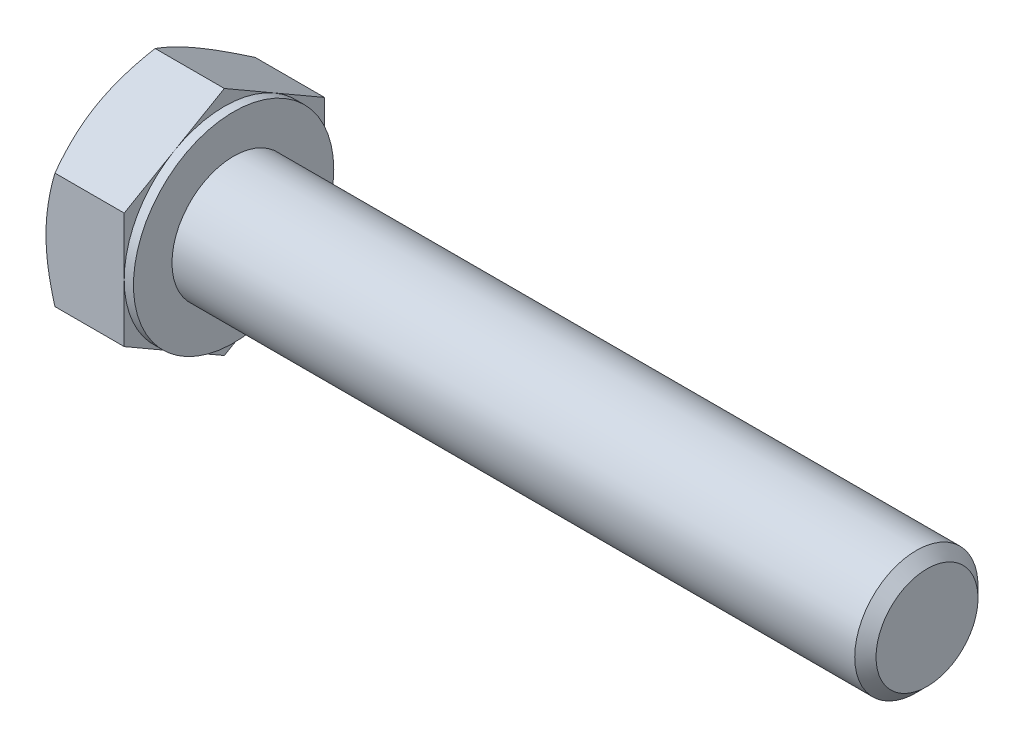
ISO-10303-21;
HEADER;
FILE_DESCRIPTION(('STEP AP214'),'2;1');
FILE_NAME('part.step','',(''),(''),'','','');
FILE_SCHEMA(('AUTOMOTIVE_DESIGN { 1 0 10303 214 1 1 1 1 }'));
ENDSEC;
DATA;
#1=APPLICATION_CONTEXT('core data for automotive mechanical design processes');
#2=APPLICATION_PROTOCOL_DEFINITION('international standard','automotive_design',2000,#1);
#3=PRODUCT_CONTEXT('',#1,'mechanical');
#4=PRODUCT('Part','Part','',(#3));
#5=PRODUCT_RELATED_PRODUCT_CATEGORY('part','',(#4));
#6=PRODUCT_DEFINITION_FORMATION('','',#4);
#7=PRODUCT_DEFINITION_CONTEXT('part definition',#1,'design');
#8=PRODUCT_DEFINITION('design','',#6,#7);
#9=PRODUCT_DEFINITION_SHAPE('','',#8);
#10=(LENGTH_UNIT() NAMED_UNIT(*) SI_UNIT(.MILLI.,.METRE.));
#11=(NAMED_UNIT(*) PLANE_ANGLE_UNIT() SI_UNIT($,.RADIAN.));
#12=(NAMED_UNIT(*) SI_UNIT($,.STERADIAN.) SOLID_ANGLE_UNIT());
#13=UNCERTAINTY_MEASURE_WITH_UNIT(LENGTH_MEASURE(1.E-05),#10,'distance_accuracy_value','');
#14=(GEOMETRIC_REPRESENTATION_CONTEXT(3) GLOBAL_UNCERTAINTY_ASSIGNED_CONTEXT((#13)) GLOBAL_UNIT_ASSIGNED_CONTEXT((#10,
#11,#12)) REPRESENTATION_CONTEXT('',''));
#15=CARTESIAN_POINT('',(0.,0.,0.));
#16=DIRECTION('',(0.,0.,1.));
#17=DIRECTION('',(1.,0.,0.));
#18=AXIS2_PLACEMENT_3D('',#15,#16,#17);
#19=CARTESIAN_POINT('',(5.675,7.50555349946514,0.));
#20=DIRECTION('',(1.,0.,0.));
#21=DIRECTION('',(0.,0.,-1.));
#22=AXIS2_PLACEMENT_3D('',#19,#20,#21);
#23=PLANE('',#22);
#24=CARTESIAN_POINT('',(5.675,0.,0.));
#25=DIRECTION('',(1.,0.,0.));
#26=DIRECTION('',(0.,0.,-1.));
#27=AXIS2_PLACEMENT_3D('',#24,#25,#26);
#28=CIRCLE('',#27,4.);
#29=CARTESIAN_POINT('',(5.675,0.,-4.));
#30=VERTEX_POINT('',#29);
#31=EDGE_CURVE('E270',#30,#30,#28,.F.);
#32=ORIENTED_EDGE('',*,*,#31,.T.);
#33=EDGE_LOOP('',(#32));
#34=FACE_BOUND('',#33,.T.);
#35=CARTESIAN_POINT('',(5.675,0.,0.));
#36=DIRECTION('',(1.,0.,0.));
#37=DIRECTION('',(0.,0.,-1.));
#38=AXIS2_PLACEMENT_3D('',#35,#36,#37);
#39=CIRCLE('',#38,6.5);
#40=CARTESIAN_POINT('',(5.675,0.,-6.5));
#41=VERTEX_POINT('',#40);
#42=EDGE_CURVE('E289',#41,#41,#39,.T.);
#43=ORIENTED_EDGE('',*,*,#42,.T.);
#44=EDGE_LOOP('',(#43));
#45=FACE_BOUND('',#44,.T.);
#46=ADVANCED_FACE('F32',(#34,#45),#23,.T.);
#47=CARTESIAN_POINT('',(0.,0.,0.));
#48=DIRECTION('',(-1.,0.,0.));
#49=DIRECTION('',(0.,0.,1.));
#50=AXIS2_PLACEMENT_3D('',#47,#48,#49);
#51=CYLINDRICAL_SURFACE('',#50,4.);
#52=ORIENTED_EDGE('',*,*,#31,.F.);
#53=EDGE_LOOP('',(#52));
#54=FACE_BOUND('',#53,.T.);
#55=CARTESIAN_POINT('',(49.9845,0.,0.));
#56=DIRECTION('',(-1.,0.,0.));
#57=DIRECTION('',(0.,0.,1.));
#58=AXIS2_PLACEMENT_3D('',#55,#56,#57);
#59=CIRCLE('',#58,4.);
#60=CARTESIAN_POINT('',(49.9845,0.,4.));
#61=VERTEX_POINT('',#60);
#62=EDGE_CURVE('E267',#61,#61,#59,.T.);
#63=ORIENTED_EDGE('',*,*,#62,.T.);
#64=EDGE_LOOP('',(#63));
#65=FACE_BOUND('',#64,.T.);
#66=ADVANCED_FACE('F241',(#54,#65),#51,.T.);
#67=CARTESIAN_POINT('',(50.675,0.,0.));
#68=DIRECTION('',(-1.,0.,0.));
#69=DIRECTION('',(0.,0.,1.));
#70=AXIS2_PLACEMENT_3D('',#67,#68,#69);
#71=CONICAL_SURFACE('',#70,3.3095,0.785398163397441);
#72=ORIENTED_EDGE('',*,*,#62,.F.);
#73=EDGE_LOOP('',(#72));
#74=FACE_BOUND('',#73,.T.);
#75=CARTESIAN_POINT('',(50.675,0.,0.));
#76=DIRECTION('',(-1.,0.,0.));
#77=DIRECTION('',(0.,0.,1.));
#78=AXIS2_PLACEMENT_3D('',#75,#76,#77);
#79=CIRCLE('',#78,3.3095);
#80=CARTESIAN_POINT('',(50.675,0.,3.3095));
#81=VERTEX_POINT('',#80);
#82=EDGE_CURVE('E265',#81,#81,#79,.T.);
#83=ORIENTED_EDGE('',*,*,#82,.T.);
#84=EDGE_LOOP('',(#83));
#85=FACE_BOUND('',#84,.T.);
#86=ADVANCED_FACE('F246',(#74,#85),#71,.T.);
#87=CARTESIAN_POINT('',(50.675,0.,0.));
#88=DIRECTION('',(-1.,0.,0.));
#89=DIRECTION('',(0.,0.,1.));
#90=AXIS2_PLACEMENT_3D('',#87,#88,#89);
#91=PLANE('',#90);
#92=ORIENTED_EDGE('',*,*,#82,.F.);
#93=EDGE_LOOP('',(#92));
#94=FACE_BOUND('',#93,.T.);
#95=ADVANCED_FACE('F253',(#94),#91,.F.);
#96=CARTESIAN_POINT('',(5.075,6.5,0.));
#97=DIRECTION('',(1.,0.,0.));
#98=DIRECTION('',(0.,0.,-1.));
#99=AXIS2_PLACEMENT_3D('',#96,#97,#98);
#100=PLANE('',#99);
#101=DIRECTION('',(0.,0.500000000000001,0.866025403784438));
#102=VECTOR('',#101,1.);
#103=CARTESIAN_POINT('',(5.075,3.75277674973256,-6.5));
#104=LINE('',#103,#102);
#105=CARTESIAN_POINT('',(5.075,3.75277674973256,-6.5));
#106=VERTEX_POINT('',#105);
#107=CARTESIAN_POINT('',(5.075,5.62916512459885,-3.25000000000001));
#108=VERTEX_POINT('',#107);
#109=EDGE_CURVE('E165',#106,#108,#104,.T.);
#110=ORIENTED_EDGE('',*,*,#109,.T.);
#111=CARTESIAN_POINT('',(5.075,0.,0.));
#112=DIRECTION('',(-1.,0.,0.));
#113=DIRECTION('',(0.,0.,1.));
#114=AXIS2_PLACEMENT_3D('',#111,#112,#113);
#115=CIRCLE('',#114,6.5);
#116=CARTESIAN_POINT('',(5.075,0.,-6.5));
#117=VERTEX_POINT('',#116);
#118=EDGE_CURVE('E48',#108,#117,#115,.T.);
#119=ORIENTED_EDGE('',*,*,#118,.T.);
#120=DIRECTION('',(0.,1.,0.));
#121=VECTOR('',#120,1.);
#122=CARTESIAN_POINT('',(5.075,3.75277674973256,-6.5));
#123=LINE('',#122,#121);
#124=EDGE_CURVE('E37',#117,#106,#123,.T.);
#125=ORIENTED_EDGE('',*,*,#124,.T.);
#126=EDGE_LOOP('',(#110,#119,#125));
#127=FACE_BOUND('',#126,.T.);
#128=ADVANCED_FACE('F256',(#127),#100,.T.);
#129=CARTESIAN_POINT('',(5.075,7.50555349946514,0.));
#130=VERTEX_POINT('',#129);
#131=EDGE_CURVE('E163',#108,#130,#104,.T.);
#132=ORIENTED_EDGE('',*,*,#131,.T.);
#133=DIRECTION('',(0.,-0.500000000000001,0.866025403784438));
#134=VECTOR('',#133,1.);
#135=CARTESIAN_POINT('',(5.075,7.50555349946514,0.));
#136=LINE('',#135,#134);
#137=CARTESIAN_POINT('',(5.075,5.62916512459885,3.25000000000001));
#138=VERTEX_POINT('',#137);
#139=EDGE_CURVE('E162',#130,#138,#136,.T.);
#140=ORIENTED_EDGE('',*,*,#139,.T.);
#141=EDGE_CURVE('E151',#138,#108,#115,.T.);
#142=ORIENTED_EDGE('',*,*,#141,.T.);
#143=EDGE_LOOP('',(#132,#140,#142));
#144=FACE_BOUND('',#143,.T.);
#145=ADVANCED_FACE('F261',(#144),#100,.T.);
#146=CARTESIAN_POINT('',(5.075,3.75277674973256,6.5));
#147=VERTEX_POINT('',#146);
#148=EDGE_CURVE('E130',#138,#147,#136,.T.);
#149=ORIENTED_EDGE('',*,*,#148,.T.);
#150=DIRECTION('',(0.,-1.,0.));
#151=VECTOR('',#150,1.);
#152=CARTESIAN_POINT('',(5.075,3.75277674973256,6.5));
#153=LINE('',#152,#151);
#154=CARTESIAN_POINT('',(5.075,0.,6.5));
#155=VERTEX_POINT('',#154);
#156=EDGE_CURVE('E124',#147,#155,#153,.T.);
#157=ORIENTED_EDGE('',*,*,#156,.T.);
#158=EDGE_CURVE('E128',#155,#138,#115,.T.);
#159=ORIENTED_EDGE('',*,*,#158,.T.);
#160=EDGE_LOOP('',(#149,#157,#159));
#161=FACE_BOUND('',#160,.T.);
#162=ADVANCED_FACE('F126',(#161),#100,.T.);
#163=CARTESIAN_POINT('',(5.075,-3.75277674973255,6.5));
#164=VERTEX_POINT('',#163);
#165=EDGE_CURVE('E134',#155,#164,#153,.T.);
#166=ORIENTED_EDGE('',*,*,#165,.T.);
#167=DIRECTION('',(0.,-0.500000000000002,-0.866025403784438));
#168=VECTOR('',#167,1.);
#169=CARTESIAN_POINT('',(5.075,-7.50555349946514,0.));
#170=LINE('',#169,#168);
#171=CARTESIAN_POINT('',(5.075,-5.62916512459884,3.25000000000001));
#172=VERTEX_POINT('',#171);
#173=EDGE_CURVE('E141',#164,#172,#170,.T.);
#174=ORIENTED_EDGE('',*,*,#173,.T.);
#175=EDGE_CURVE('E138',#172,#155,#115,.T.);
#176=ORIENTED_EDGE('',*,*,#175,.T.);
#177=EDGE_LOOP('',(#166,#174,#176));
#178=FACE_BOUND('',#177,.T.);
#179=ADVANCED_FACE('F139',(#178),#100,.T.);
#180=CARTESIAN_POINT('',(5.075,-7.50555349946514,0.));
#181=VERTEX_POINT('',#180);
#182=EDGE_CURVE('E157',#172,#181,#170,.T.);
#183=ORIENTED_EDGE('',*,*,#182,.T.);
#184=DIRECTION('',(0.,0.5,-0.866025403784439));
#185=VECTOR('',#184,1.);
#186=CARTESIAN_POINT('',(5.075,-3.75277674973257,-6.5));
#187=LINE('',#186,#185);
#188=CARTESIAN_POINT('',(5.075,-5.62916512459885,-3.25));
#189=VERTEX_POINT('',#188);
#190=EDGE_CURVE('E325',#181,#189,#187,.T.);
#191=ORIENTED_EDGE('',*,*,#190,.T.);
#192=EDGE_CURVE('E145',#189,#172,#115,.T.);
#193=ORIENTED_EDGE('',*,*,#192,.T.);
#194=EDGE_LOOP('',(#183,#191,#193));
#195=FACE_BOUND('',#194,.T.);
#196=ADVANCED_FACE('F330',(#195),#100,.T.);
#197=CARTESIAN_POINT('',(5.075,-3.75277674973257,-6.5));
#198=VERTEX_POINT('',#197);
#199=EDGE_CURVE('E152',#189,#198,#187,.T.);
#200=ORIENTED_EDGE('',*,*,#199,.T.);
#201=EDGE_CURVE('E11',#198,#117,#123,.T.);
#202=ORIENTED_EDGE('',*,*,#201,.T.);
#203=EDGE_CURVE('E343',#117,#189,#115,.T.);
#204=ORIENTED_EDGE('',*,*,#203,.T.);
#205=EDGE_LOOP('',(#200,#202,#204));
#206=FACE_BOUND('',#205,.T.);
#207=ADVANCED_FACE('F262',(#206),#100,.T.);
#208=CARTESIAN_POINT('',(0.,0.,0.));
#209=DIRECTION('',(-1.,0.,0.));
#210=DIRECTION('',(0.,0.,1.));
#211=AXIS2_PLACEMENT_3D('',#208,#209,#210);
#212=CYLINDRICAL_SURFACE('',#211,6.5);
#213=ORIENTED_EDGE('',*,*,#118,.F.);
#214=ORIENTED_EDGE('',*,*,#141,.F.);
#215=ORIENTED_EDGE('',*,*,#158,.F.);
#216=ORIENTED_EDGE('',*,*,#175,.F.);
#217=ORIENTED_EDGE('',*,*,#192,.F.);
#218=ORIENTED_EDGE('',*,*,#203,.F.);
#219=EDGE_LOOP('',(#213,#214,#215,#216,#217,#218));
#220=FACE_BOUND('',#219,.T.);
#221=ORIENTED_EDGE('',*,*,#42,.F.);
#222=EDGE_LOOP('',(#221));
#223=FACE_BOUND('',#222,.T.);
#224=ADVANCED_FACE('F148',(#220,#223),#212,.T.);
#225=CARTESIAN_POINT('',(0.,7.50555349946514,0.));
#226=DIRECTION('',(1.,0.,0.));
#227=DIRECTION('',(0.,0.,-1.));
#228=AXIS2_PLACEMENT_3D('',#225,#226,#227);
#229=PLANE('',#228);
#230=CARTESIAN_POINT('',(0.,0.,0.));
#231=DIRECTION('',(1.,0.,0.));
#232=DIRECTION('',(0.,0.,-1.));
#233=AXIS2_PLACEMENT_3D('',#230,#231,#232);
#234=CIRCLE('',#233,6.5);
#235=CARTESIAN_POINT('',(0.,0.,-6.5));
#236=VERTEX_POINT('',#235);
#237=CARTESIAN_POINT('',(0.,5.62916512459885,-3.25000000000001));
#238=VERTEX_POINT('',#237);
#239=EDGE_CURVE('E288',#236,#238,#234,.T.);
#240=ORIENTED_EDGE('',*,*,#239,.F.);
#241=CARTESIAN_POINT('',(0.,-5.62916512459885,-3.25));
#242=VERTEX_POINT('',#241);
#243=EDGE_CURVE('E285',#242,#236,#234,.T.);
#244=ORIENTED_EDGE('',*,*,#243,.F.);
#245=CARTESIAN_POINT('',(0.,-5.62916512459884,3.25000000000001));
#246=VERTEX_POINT('',#245);
#247=EDGE_CURVE('E287',#246,#242,#234,.T.);
#248=ORIENTED_EDGE('',*,*,#247,.F.);
#249=CARTESIAN_POINT('',(0.,0.,6.5));
#250=VERTEX_POINT('',#249);
#251=EDGE_CURVE('E297',#250,#246,#234,.T.);
#252=ORIENTED_EDGE('',*,*,#251,.F.);
#253=CARTESIAN_POINT('',(0.,0.,0.));
#254=DIRECTION('',(-1.,0.,0.));
#255=DIRECTION('',(0.,0.,1.));
#256=AXIS2_PLACEMENT_3D('',#253,#254,#255);
#257=CIRCLE('',#256,6.5);
#258=CARTESIAN_POINT('',(0.,5.62916512459885,3.25000000000001));
#259=VERTEX_POINT('',#258);
#260=EDGE_CURVE('E166',#250,#259,#257,.T.);
#261=ORIENTED_EDGE('',*,*,#260,.T.);
#262=EDGE_CURVE('E292',#238,#259,#234,.T.);
#263=ORIENTED_EDGE('',*,*,#262,.F.);
#264=EDGE_LOOP('',(#240,#244,#248,#252,#261,#263));
#265=FACE_BOUND('',#264,.T.);
#266=ADVANCED_FACE('F195',(#265),#229,.F.);
#267=CARTESIAN_POINT('',(0.,0.,0.));
#268=DIRECTION('',(1.,0.,0.));
#269=DIRECTION('',(0.,0.,-1.));
#270=AXIS2_PLACEMENT_3D('',#267,#268,#269);
#271=CONICAL_SURFACE('',#270,6.5,1.0471975511966);
#272=CARTESIAN_POINT('',(0.580623251805864,3.75266127967873,6.5002));
#273=CARTESIAN_POINT('',(0.533004423075482,3.8351516191275,6.35732254094112));
#274=CARTESIAN_POINT('',(0.487546700602703,3.91794952254312,6.21391236546508));
#275=CARTESIAN_POINT('',(0.401548682023043,4.08421773795794,5.9259273686828));
#276=CARTESIAN_POINT('',(0.361010507228023,4.16768832359105,5.78135207342873));
#277=CARTESIAN_POINT('',(0.247571001123207,4.41943655294051,5.34531134947996));
#278=CARTESIAN_POINT('',(0.183047807128738,4.58870793403689,5.05212471715368));
#279=CARTESIAN_POINT('',(0.10738658354749,4.84201947708215,4.61337625445563));
#280=CARTESIAN_POINT('',(0.0858328564569867,4.92530276780316,4.46912536350531));
#281=CARTESIAN_POINT('',(0.0496903146061186,5.09224566542477,4.17997178286191));
#282=CARTESIAN_POINT('',(0.0351008844596662,5.17590523841627,4.03506915190111));
#283=CARTESIAN_POINT('',(0.0132587525073466,5.34336968579964,3.74501222057168));
#284=CARTESIAN_POINT('',(0.00599772432210777,5.427174286676,3.59985839394579));
#285=CARTESIAN_POINT('',(-0.00103969741776826,5.59485627940483,3.30942466302505));
#286=CARTESIAN_POINT('',(-0.000816322187794798,5.6787336689286,3.16414476276364));
#287=CARTESIAN_POINT('',(0.0100834585151662,5.90853103021317,2.76612405757351));
#288=CARTESIAN_POINT('',(0.0283818178694145,6.05437578112764,2.51351353897243));
#289=CARTESIAN_POINT('',(0.0864063414576768,6.34509659313135,2.00997032176432));
#290=CARTESIAN_POINT('',(0.126152338538247,6.48997163178545,1.75903939406692));
#291=CARTESIAN_POINT('',(0.225505903202152,6.78127752911039,1.25448277935568));
#292=CARTESIAN_POINT('',(0.285534425638029,6.92767163007068,1.00092075856409));
#293=CARTESIAN_POINT('',(0.421774992509871,7.21827667013277,0.497578064240954));
#294=CARTESIAN_POINT('',(0.497955034163596,7.36249133098589,0.247790944447035));
#295=CARTESIAN_POINT('',(0.580623251805871,7.50566896951898,-0.000200000000001229));
#296=B_SPLINE_CURVE_WITH_KNOTS('',3,(#272,#273,#274,#275,#276,#277,#278,#279,#280,#281,#282,
#283,#284,#285,#286,#287,#288,#289,#290,#291,#292,#293,#294,#295),.UNSPECIFIED.,.F.,.F.,(4,2,2,
2,2,2,2,2,2,2,2,4),(0.,0.515105052395587,1.03043143507524,2.06322554824262,2.56697389547996,
3.07067772176454,3.57380860368928,4.0769239424252,4.9527935470566,5.82947446853466,
6.72559912449737,7.61996451221046),.UNSPECIFIED.);
#297=CARTESIAN_POINT('',(0.580556583600766,7.50555349946514,0.));
#298=VERTEX_POINT('',#297);
#299=EDGE_CURVE('E213',#259,#298,#296,.T.);
#300=ORIENTED_EDGE('',*,*,#299,.T.);
#301=CARTESIAN_POINT('',(0.580623251805871,7.50566896951898,0.0002));
#302=CARTESIAN_POINT('',(0.533004423075489,7.4231786300702,-0.14267745905888));
#303=CARTESIAN_POINT('',(0.487546700602709,7.34038072665459,-0.286087634534913));
#304=CARTESIAN_POINT('',(0.401548682023048,7.17411251123976,-0.574072631317194));
#305=CARTESIAN_POINT('',(0.361010507228028,7.09064192560665,-0.718647926571264));
#306=CARTESIAN_POINT('',(0.24757100112321,6.83889369625719,-1.15468865052003));
#307=CARTESIAN_POINT('',(0.183047807128741,6.66962231516081,-1.44787528284632));
#308=CARTESIAN_POINT('',(0.107386583547493,6.41631077211555,-1.88662374554437));
#309=CARTESIAN_POINT('',(0.0858328564569883,6.33302748139455,-2.03087463649469));
#310=CARTESIAN_POINT('',(0.04969031460612,6.16608458377293,-2.32002821713809));
#311=CARTESIAN_POINT('',(0.035100884459668,6.08242501078143,-2.46493084809889));
#312=CARTESIAN_POINT('',(0.013258752507348,5.91496056339807,-2.75498777942832));
#313=CARTESIAN_POINT('',(0.00599772432210829,5.8311559625217,-2.90014160605421));
#314=CARTESIAN_POINT('',(-0.00103969741776879,5.66347396979287,-3.19057533697495));
#315=CARTESIAN_POINT('',(-0.000816322187795495,5.5795965802691,-3.33585523723636));
#316=CARTESIAN_POINT('',(0.010083458515165,5.34979921898453,-3.73387594242649));
#317=CARTESIAN_POINT('',(0.0283818178694128,5.20395446807007,-3.98648646102757));
#318=CARTESIAN_POINT('',(0.0864063414576741,4.91323365606635,-4.49002967823568));
#319=CARTESIAN_POINT('',(0.126152338538243,4.76835861741226,-4.74096060593308));
#320=CARTESIAN_POINT('',(0.225505903202148,4.47705272008731,-5.24551722064432));
#321=CARTESIAN_POINT('',(0.285534425638024,4.33065861912702,-5.49907924143591));
#322=CARTESIAN_POINT('',(0.421774992509866,4.04005357906493,-6.00242193575904));
#323=CARTESIAN_POINT('',(0.49795503416359,3.89583891821181,-6.25220905555296));
#324=CARTESIAN_POINT('',(0.580623251805864,3.75266127967872,-6.5002));
#325=B_SPLINE_CURVE_WITH_KNOTS('',3,(#301,#302,#303,#304,#305,#306,#307,#308,#309,#310,#311,
#312,#313,#314,#315,#316,#317,#318,#319,#320,#321,#322,#323,#324),.UNSPECIFIED.,.F.,.F.,(4,2,2,
2,2,2,2,2,2,2,2,4),(0.,0.515105052395588,1.03043143507525,2.06322554824262,2.56697389547996,
3.07067772176454,3.57380860368928,4.0769239424252,4.95279354705661,5.82947446853467,
6.72559912449737,7.61996451221046),.UNSPECIFIED.);
#326=EDGE_CURVE('E56',#298,#238,#325,.T.);
#327=ORIENTED_EDGE('',*,*,#326,.T.);
#328=ORIENTED_EDGE('',*,*,#262,.T.);
#329=EDGE_LOOP('',(#300,#327,#328));
#330=FACE_BOUND('',#329,.T.);
#331=ADVANCED_FACE('F339',(#330),#271,.T.);
#332=CARTESIAN_POINT('',(3.18835311590245,-10.1137456678934,6.5));
#333=CARTESIAN_POINT('',(3.05034774010467,-9.82952666322136,6.5));
#334=CARTESIAN_POINT('',(2.91365616489937,-9.54465869649271,6.5));
#335=CARTESIAN_POINT('',(2.6436389949754,-8.97327978057919,6.5));
#336=CARTESIAN_POINT('',(2.51031392459096,-8.6867685838847,6.5));
#337=CARTESIAN_POINT('',(2.24710473482718,-8.11029837842687,6.5));
#338=CARTESIAN_POINT('',(2.11724300438679,-7.82032911201509,6.5));
#339=CARTESIAN_POINT('',(1.86279082826902,-7.23809541022337,6.5));
#340=CARTESIAN_POINT('',(1.73820013554673,-6.94583108317205,6.5));
#341=CARTESIAN_POINT('',(1.49176685426961,-6.34906440963034,6.5));
#342=CARTESIAN_POINT('',(1.37014257641265,-6.0444714228887,6.5));
#343=CARTESIAN_POINT('',(1.13601865758149,-5.43173420957314,6.5));
#344=CARTESIAN_POINT('',(1.02352003558022,-5.12358959079844,6.5));
#345=CARTESIAN_POINT('',(0.810575368239912,-4.50382569782258,6.5));
#346=CARTESIAN_POINT('',(0.710105232302001,-4.19221478266991,6.5));
#347=CARTESIAN_POINT('',(0.52442016614445,-3.56452019206011,6.5));
#348=CARTESIAN_POINT('',(0.439200468206414,-3.24843794792919,6.5));
#349=CARTESIAN_POINT('',(0.288524223401194,-2.61335465712781,6.5));
#350=CARTESIAN_POINT('',(0.222961865744745,-2.29437912059504,6.5));
#351=CARTESIAN_POINT('',(0.115312883130722,-1.65238219405861,6.5));
#352=CARTESIAN_POINT('',(0.0732239014690607,-1.32936121354428,6.5));
#353=CARTESIAN_POINT('',(0.0304887136381648,-0.84523117183997,6.5));
#354=CARTESIAN_POINT('',(0.0196493434273831,-0.684982209663087,6.5));
#355=CARTESIAN_POINT('',(0.00475298486143921,-0.364162349065445,6.5));
#356=CARTESIAN_POINT('',(0.00069588290883136,-0.203591456081864,6.5));
#357=CARTESIAN_POINT('',(-0.000531597190095306,0.117577430374311,6.5));
#358=CARTESIAN_POINT('',(0.0022980901701271,0.278175424090157,6.5));
#359=CARTESIAN_POINT('',(0.0147726845547646,0.599108972823519,6.5));
#360=CARTESIAN_POINT('',(0.0244179260500526,0.759444514574231,6.5));
#361=CARTESIAN_POINT('',(0.0554961939343011,1.14369946602535,6.5));
#362=CARTESIAN_POINT('',(0.0801030490514529,1.36736763045087,6.5));
#363=CARTESIAN_POINT('',(0.141246537453379,1.81305591311689,6.5));
#364=CARTESIAN_POINT('',(0.177784759614454,2.0350758078311,6.5));
#365=CARTESIAN_POINT('',(0.303360001332118,2.69839633433797,6.5));
#366=CARTESIAN_POINT('',(0.408335815147598,3.13672010374359,6.5));
#367=CARTESIAN_POINT('',(0.590564593134945,3.7923211291812,6.5));
#368=CARTESIAN_POINT('',(0.656313198979096,4.01299150874075,6.5));
#369=CARTESIAN_POINT('',(0.794681634200737,4.45218859008393,6.5));
#370=CARTESIAN_POINT('',(0.867301513122623,4.67071527639821,6.5));
#371=CARTESIAN_POINT('',(1.01824353854296,5.10569490252728,6.5));
#372=CARTESIAN_POINT('',(1.0965638823284,5.32214847365077,6.5));
#373=CARTESIAN_POINT('',(1.25798086164822,5.75325725773041,6.5));
#374=CARTESIAN_POINT('',(1.34107741035996,5.96791250329558,6.5));
#375=CARTESIAN_POINT('',(1.56029019583042,6.51888445936374,6.5));
#376=CARTESIAN_POINT('',(1.69936356666534,6.85402316813628,6.5));
#377=CARTESIAN_POINT('',(1.98501958087353,7.52109583939394,6.5));
#378=CARTESIAN_POINT('',(2.13160288780792,7.85302951559934,6.5));
#379=CARTESIAN_POINT('',(2.43059748044952,8.51437865518659,6.5));
#380=CARTESIAN_POINT('',(2.5830105759696,8.84379329784094,6.5));
#381=CARTESIAN_POINT('',(2.89234869374927,9.50047798683785,6.5));
#382=CARTESIAN_POINT('',(3.04927357220059,9.82774810112758,6.49999999999999));
#383=CARTESIAN_POINT('',(3.36692013130637,10.4809971975748,6.49999999999999));
#384=CARTESIAN_POINT('',(3.52764676491733,10.8069737667408,6.49999999999999));
#385=CARTESIAN_POINT('',(3.85198555554899,11.4574882901034,6.49999999999999));
#386=CARTESIAN_POINT('',(4.01559773123065,11.7820262349792,6.49999999999999));
#387=CARTESIAN_POINT('',(4.50986185003773,12.7537468114441,6.49999999999999));
#388=CARTESIAN_POINT('',(4.8439999797854,13.3991555932469,6.49999999999999));
#389=CARTESIAN_POINT('',(5.48575990265919,14.6239779290894,6.49999999999999));
#390=CARTESIAN_POINT('',(5.79279643372278,15.2036995760604,6.49999999999999));
#391=CARTESIAN_POINT('',(6.4106918822763,16.3611382637875,6.49999999999999));
#392=CARTESIAN_POINT('',(6.72155099010108,16.938855202873,6.49999999999999));
#393=CARTESIAN_POINT('',(7.34519775439014,18.0910273555999,6.49999999999999));
#394=CARTESIAN_POINT('',(7.65797694168863,18.665487160613,6.49999999999999));
#395=CARTESIAN_POINT('',(8.28574397153078,19.8131486204439,6.49999999999999));
#396=CARTESIAN_POINT('',(8.60073166294278,20.3863503578957,6.49999999999999));
#397=CARTESIAN_POINT('',(8.91652967168741,20.9591024521449,6.49999999999999));
#398=B_SPLINE_CURVE_WITH_KNOTS('',3,(#332,#333,#334,#335,#336,#337,#338,#339,#340,#341,#342,
#343,#344,#345,#346,#347,#348,#349,#350,#351,#352,#353,#354,#355,#356,#357,#358,#359,#360,#361,
#362,#363,#364,#365,#366,#367,#368,#369,#370,#371,#372,#373,#374,#375,#376,#377,#378,#379,#380,
#381,#382,#383,#384,#385,#386,#387,#388,#389,#390,#391,#392,#393,#394,#395,#396,#397),
.UNSPECIFIED.,.F.,.F.,(4,2,2,2,2,2,2,2,2,2,2,2,2,2,2,2,2,2,2,2,2,2,2,2,2,2,2,2,2,2,2,2,4),(0.,
0.947868666702312,1.89588406483492,2.84900320930536,3.80207763304314,4.7858977408271,
5.76982755141751,6.75175256246684,7.73337005764393,8.7096047489099,9.68574140951123,
10.1674651053568,10.6491807326436,11.1309009419855,11.6126447932157,12.287317572382,
12.9620802330383,14.312318438093,15.0030310344276,15.6937486114326,16.384248697357,
17.0747362352244,18.1631508683747,19.2516618378193,20.3405135142583,21.4293305231019,
22.5196540547636,23.6099846401957,25.7902468235016,27.7582608872417,29.7263733429304,
31.6886408595598,33.6507753806318),.UNSPECIFIED.);
#399=CARTESIAN_POINT('',(0.58055658360076,3.75277674973256,6.5));
#400=VERTEX_POINT('',#399);
#401=EDGE_CURVE('E225',#250,#400,#398,.T.);
#402=ORIENTED_EDGE('',*,*,#401,.T.);
#403=EDGE_CURVE('E224',#400,#259,#296,.T.);
#404=ORIENTED_EDGE('',*,*,#403,.T.);
#405=ORIENTED_EDGE('',*,*,#260,.F.);
#406=EDGE_LOOP('',(#402,#404,#405));
#407=FACE_BOUND('',#406,.T.);
#408=ADVANCED_FACE('F335',(#407),#271,.T.);
#409=CARTESIAN_POINT('',(0.580556583600759,-3.75277674973256,6.5));
#410=VERTEX_POINT('',#409);
#411=EDGE_CURVE('E268',#410,#250,#398,.T.);
#412=ORIENTED_EDGE('',*,*,#411,.T.);
#413=ORIENTED_EDGE('',*,*,#251,.T.);
#414=CARTESIAN_POINT('',(0.58062325180587,-7.50566896951898,-0.000200000000000067));
#415=CARTESIAN_POINT('',(0.533004423075488,-7.4231786300702,0.14267745905888));
#416=CARTESIAN_POINT('',(0.487546700602709,-7.34038072665459,0.286087634534912));
#417=CARTESIAN_POINT('',(0.401548682023048,-7.17411251123976,0.574072631317194));
#418=CARTESIAN_POINT('',(0.361010507228027,-7.09064192560665,0.718647926571263));
#419=CARTESIAN_POINT('',(0.24757100112321,-6.83889369625719,1.15468865052003));
#420=CARTESIAN_POINT('',(0.18304780712874,-6.66962231516081,1.44787528284632));
#421=CARTESIAN_POINT('',(0.107386583547492,-6.41631077211555,1.88662374554437));
#422=CARTESIAN_POINT('',(0.0858328564569877,-6.33302748139454,2.03087463649469));
#423=CARTESIAN_POINT('',(0.0496903146061188,-6.16608458377293,2.32002821713809));
#424=CARTESIAN_POINT('',(0.0351008844596663,-6.08242501078143,2.46493084809889));
#425=CARTESIAN_POINT('',(0.013258752507346,-5.91496056339806,2.75498777942832));
#426=CARTESIAN_POINT('',(0.00599772432210666,-5.8311559625217,2.90014160605421));
#427=CARTESIAN_POINT('',(-0.00103969741777016,-5.66347396979287,3.19057533697495));
#428=CARTESIAN_POINT('',(-0.000816322187796993,-5.5795965802691,3.33585523723636));
#429=CARTESIAN_POINT('',(0.0100834585151632,-5.34979921898453,3.73387594242649));
#430=CARTESIAN_POINT('',(0.0283818178694107,-5.20395446807007,3.98648646102757));
#431=CARTESIAN_POINT('',(0.0864063414576716,-4.91323365606635,4.49002967823568));
#432=CARTESIAN_POINT('',(0.126152338538241,-4.76835861741225,4.74096060593308));
#433=CARTESIAN_POINT('',(0.225505903202145,-4.47705272008731,5.24551722064432));
#434=CARTESIAN_POINT('',(0.285534425638022,-4.33065861912702,5.49907924143591));
#435=CARTESIAN_POINT('',(0.421774992509864,-4.04005357906492,6.00242193575904));
#436=CARTESIAN_POINT('',(0.497955034163589,-3.8958389182118,6.25220905555296));
#437=CARTESIAN_POINT('',(0.580623251805863,-3.75266127967872,6.5002));
#438=B_SPLINE_CURVE_WITH_KNOTS('',3,(#414,#415,#416,#417,#418,#419,#420,#421,#422,#423,#424,
#425,#426,#427,#428,#429,#430,#431,#432,#433,#434,#435,#436,#437),.UNSPECIFIED.,.F.,.F.,(4,2,2,
2,2,2,2,2,2,2,2,4),(0.,0.515105052395588,1.03043143507525,2.06322554824262,2.56697389547996,
3.07067772176454,3.57380860368928,4.0769239424252,4.9527935470566,5.82947446853467,
6.72559912449737,7.61996451221046),.UNSPECIFIED.);
#439=EDGE_CURVE('E215',#246,#410,#438,.T.);
#440=ORIENTED_EDGE('',*,*,#439,.T.);
#441=EDGE_LOOP('',(#412,#413,#440));
#442=FACE_BOUND('',#441,.T.);
#443=ADVANCED_FACE('F184',(#442),#271,.T.);
#444=CARTESIAN_POINT('',(0.580556583600766,-7.50555349946514,0.));
#445=VERTEX_POINT('',#444);
#446=EDGE_CURVE('E208',#445,#246,#438,.T.);
#447=ORIENTED_EDGE('',*,*,#446,.T.);
#448=ORIENTED_EDGE('',*,*,#247,.T.);
#449=CARTESIAN_POINT('',(0.580623251805868,-3.75266127967874,-6.5002));
#450=CARTESIAN_POINT('',(0.533004423075487,-3.83515161912751,-6.35732254094112));
#451=CARTESIAN_POINT('',(0.487546700602708,-3.91794952254313,-6.21391236546509));
#452=CARTESIAN_POINT('',(0.401548682023047,-4.08421773795795,-5.9259273686828));
#453=CARTESIAN_POINT('',(0.361010507228027,-4.16768832359106,-5.78135207342874));
#454=CARTESIAN_POINT('',(0.24757100112321,-4.41943655294052,-5.34531134947996));
#455=CARTESIAN_POINT('',(0.183047807128741,-4.5887079340369,-5.05212471715368));
#456=CARTESIAN_POINT('',(0.107386583547494,-4.84201947708216,-4.61337625445563));
#457=CARTESIAN_POINT('',(0.08583285645699,-4.92530276780317,-4.46912536350531));
#458=CARTESIAN_POINT('',(0.0496903146061218,-5.09224566542478,-4.17997178286191));
#459=CARTESIAN_POINT('',(0.0351008844596695,-5.17590523841628,-4.03506915190111));
#460=CARTESIAN_POINT('',(0.0132587525073497,-5.34336968579964,-3.74501222057168));
#461=CARTESIAN_POINT('',(0.00599772432211062,-5.42717428667601,-3.59985839394579));
#462=CARTESIAN_POINT('',(-0.0010396974177656,-5.59485627940484,-3.30942466302505));
#463=CARTESIAN_POINT('',(-0.000816322187792008,-5.67873366892861,-3.16414476276364));
#464=CARTESIAN_POINT('',(0.0100834585151689,-5.90853103021318,-2.7661240575735));
#465=CARTESIAN_POINT('',(0.0283818178694165,-6.05437578112764,-2.51351353897243));
#466=CARTESIAN_POINT('',(0.0864063414576782,-6.34509659313135,-2.00997032176432));
#467=CARTESIAN_POINT('',(0.126152338538248,-6.48997163178545,-1.75903939406692));
#468=CARTESIAN_POINT('',(0.225505903202153,-6.78127752911039,-1.25448277935568));
#469=CARTESIAN_POINT('',(0.28553442563803,-6.92767163007068,-1.00092075856409));
#470=CARTESIAN_POINT('',(0.421774992509872,-7.21827667013277,-0.497578064240955));
#471=CARTESIAN_POINT('',(0.497955034163596,-7.36249133098589,-0.247790944447036));
#472=CARTESIAN_POINT('',(0.58062325180587,-7.50566896951898,0.000200000000000265));
#473=B_SPLINE_CURVE_WITH_KNOTS('',3,(#449,#450,#451,#452,#453,#454,#455,#456,#457,#458,#459,
#460,#461,#462,#463,#464,#465,#466,#467,#468,#469,#470,#471,#472),.UNSPECIFIED.,.F.,.F.,(4,2,2,
2,2,2,2,2,2,2,2,4),(0.,0.515105052395587,1.03043143507525,2.06322554824262,2.56697389547996,
3.07067772176454,3.57380860368928,4.0769239424252,4.9527935470566,5.82947446853466,
6.72559912449736,7.61996451221046),.UNSPECIFIED.);
#474=EDGE_CURVE('E214',#242,#445,#473,.T.);
#475=ORIENTED_EDGE('',*,*,#474,.T.);
#476=EDGE_LOOP('',(#447,#448,#475));
#477=FACE_BOUND('',#476,.T.);
#478=ADVANCED_FACE('F306',(#477),#271,.T.);
#479=CARTESIAN_POINT('',(0.58055658360076,3.75277674973256,-6.5));
#480=VERTEX_POINT('',#479);
#481=EDGE_CURVE('E216',#238,#480,#325,.T.);
#482=ORIENTED_EDGE('',*,*,#481,.T.);
#483=CARTESIAN_POINT('',(3.18835311590246,-10.1137456678934,-6.5));
#484=CARTESIAN_POINT('',(3.05034774010468,-9.82952666322138,-6.5));
#485=CARTESIAN_POINT('',(2.91365616489938,-9.54465869649274,-6.5));
#486=CARTESIAN_POINT('',(2.64363899497541,-8.97327978057922,-6.5));
#487=CARTESIAN_POINT('',(2.51031392459097,-8.68676858388472,-6.5));
#488=CARTESIAN_POINT('',(2.24710473482719,-8.11029837842689,-6.5));
#489=CARTESIAN_POINT('',(2.1172430043868,-7.82032911201512,-6.5));
#490=CARTESIAN_POINT('',(1.86279082826903,-7.2380954102234,-6.5));
#491=CARTESIAN_POINT('',(1.73820013554674,-6.94583108317207,-6.5));
#492=CARTESIAN_POINT('',(1.49176685426961,-6.34906440963036,-6.5));
#493=CARTESIAN_POINT('',(1.37014257641265,-6.04447142288872,-6.5));
#494=CARTESIAN_POINT('',(1.13601865758149,-5.43173420957316,-6.5));
#495=CARTESIAN_POINT('',(1.02352003558022,-5.12358959079846,-6.5));
#496=CARTESIAN_POINT('',(0.810575368239917,-4.5038256978226,-6.5));
#497=CARTESIAN_POINT('',(0.710105232302005,-4.19221478266993,-6.5));
#498=CARTESIAN_POINT('',(0.524420166144454,-3.56452019206012,-6.5));
#499=CARTESIAN_POINT('',(0.439200468206418,-3.24843794792921,-6.5));
#500=CARTESIAN_POINT('',(0.288524223401197,-2.61335465712783,-6.5));
#501=CARTESIAN_POINT('',(0.222961865744749,-2.29437912059505,-6.5));
#502=CARTESIAN_POINT('',(0.115312883130725,-1.65238219405862,-6.5));
#503=CARTESIAN_POINT('',(0.0732239014690632,-1.3293612135443,-6.5));
#504=CARTESIAN_POINT('',(0.0304887136381663,-0.845231171839984,-6.5));
#505=CARTESIAN_POINT('',(0.0196493434273842,-0.684982209663102,-6.5));
#506=CARTESIAN_POINT('',(0.00475298486143993,-0.364162349065459,-6.5));
#507=CARTESIAN_POINT('',(0.000695882908832078,-0.203591456081878,-6.5));
#508=CARTESIAN_POINT('',(-0.000531597190095034,0.117577430374299,-6.5));
#509=CARTESIAN_POINT('',(0.00229809017012691,0.278175424090145,-6.5));
#510=CARTESIAN_POINT('',(0.0147726845547639,0.599108972823507,-6.5));
#511=CARTESIAN_POINT('',(0.0244179260500518,0.759444514574219,-6.5));
#512=CARTESIAN_POINT('',(0.0554961939343,1.14369946602534,-6.5));
#513=CARTESIAN_POINT('',(0.0801030490514517,1.36736763045086,-6.5));
#514=CARTESIAN_POINT('',(0.141246537453378,1.81305591311688,-6.5));
#515=CARTESIAN_POINT('',(0.177784759614453,2.03507580783109,-6.5));
#516=CARTESIAN_POINT('',(0.303360001332116,2.69839633433796,-6.5));
#517=CARTESIAN_POINT('',(0.408335815147595,3.13672010374357,-6.5));
#518=CARTESIAN_POINT('',(0.590564593134941,3.79232112918118,-6.5));
#519=CARTESIAN_POINT('',(0.656313198979092,4.01299150874073,-6.5));
#520=CARTESIAN_POINT('',(0.794681634200733,4.45218859008391,-6.5));
#521=CARTESIAN_POINT('',(0.867301513122618,4.67071527639819,-6.5));
#522=CARTESIAN_POINT('',(1.01824353854295,5.10569490252726,-6.5));
#523=CARTESIAN_POINT('',(1.09656388232839,5.32214847365076,-6.5));
#524=CARTESIAN_POINT('',(1.25798086164821,5.75325725773039,-6.5));
#525=CARTESIAN_POINT('',(1.34107741035995,5.96791250329556,-6.5));
#526=CARTESIAN_POINT('',(1.56029019583041,6.51888445936372,-6.5));
#527=CARTESIAN_POINT('',(1.69936356666534,6.85402316813627,-6.5));
#528=CARTESIAN_POINT('',(1.98501958087353,7.52109583939393,-6.5));
#529=CARTESIAN_POINT('',(2.13160288780791,7.85302951559933,-6.5));
#530=CARTESIAN_POINT('',(2.43059748044951,8.51437865518657,-6.5));
#531=CARTESIAN_POINT('',(2.58301057596959,8.84379329784093,-6.5));
#532=CARTESIAN_POINT('',(2.89234869374926,9.50047798683784,-6.5));
#533=CARTESIAN_POINT('',(3.04927357220058,9.82774810112756,-6.5));
#534=CARTESIAN_POINT('',(3.36692013130636,10.4809971975748,-6.5));
#535=CARTESIAN_POINT('',(3.52764676491733,10.8069737667408,-6.5));
#536=CARTESIAN_POINT('',(3.85198555554899,11.4574882901034,-6.5));
#537=CARTESIAN_POINT('',(4.01559773123065,11.7820262349792,-6.5));
#538=CARTESIAN_POINT('',(4.50986185003773,12.753746811444,-6.5));
#539=CARTESIAN_POINT('',(4.8439999797854,13.3991555932469,-6.5));
#540=CARTESIAN_POINT('',(5.48575990265919,14.6239779290894,-6.5));
#541=CARTESIAN_POINT('',(5.79279643372278,15.2036995760604,-6.5));
#542=CARTESIAN_POINT('',(6.4106918822763,16.3611382637875,-6.5));
#543=CARTESIAN_POINT('',(6.72155099010109,16.938855202873,-6.5));
#544=CARTESIAN_POINT('',(7.34519775439014,18.0910273555999,-6.5));
#545=CARTESIAN_POINT('',(7.65797694168864,18.665487160613,-6.5));
#546=CARTESIAN_POINT('',(8.28574397153078,19.8131486204439,-6.5));
#547=CARTESIAN_POINT('',(8.60073166294279,20.3863503578957,-6.5));
#548=CARTESIAN_POINT('',(8.91652967168741,20.9591024521449,-6.5));
#549=B_SPLINE_CURVE_WITH_KNOTS('',3,(#483,#484,#485,#486,#487,#488,#489,#490,#491,#492,#493,
#494,#495,#496,#497,#498,#499,#500,#501,#502,#503,#504,#505,#506,#507,#508,#509,#510,#511,#512,
#513,#514,#515,#516,#517,#518,#519,#520,#521,#522,#523,#524,#525,#526,#527,#528,#529,#530,#531,
#532,#533,#534,#535,#536,#537,#538,#539,#540,#541,#542,#543,#544,#545,#546,#547,#548),
.UNSPECIFIED.,.F.,.F.,(4,2,2,2,2,2,2,2,2,2,2,2,2,2,2,2,2,2,2,2,2,2,2,2,2,2,2,2,2,2,2,2,4),(0.,
0.947868666702312,1.89588406483492,2.84900320930536,3.80207763304314,4.7858977408271,
5.76982755141752,6.75175256246685,7.73337005764394,8.70960474890991,9.68574140951124,
10.1674651053568,10.6491807326436,11.1309009419855,11.6126447932157,12.287317572382,
12.9620802330384,14.312318438093,15.0030310344276,15.6937486114326,16.3842486973571,
17.0747362352244,18.1631508683747,19.2516618378194,20.3405135142583,21.4293305231019,
22.5196540547637,23.6099846401957,25.7902468235016,27.7582608872418,29.7263733429304,
31.6886408595598,33.6507753806319),.UNSPECIFIED.);
#550=EDGE_CURVE('E177',#480,#236,#549,.F.);
#551=ORIENTED_EDGE('',*,*,#550,.T.);
#552=ORIENTED_EDGE('',*,*,#239,.T.);
#553=EDGE_LOOP('',(#482,#551,#552));
#554=FACE_BOUND('',#553,.T.);
#555=ADVANCED_FACE('F320',(#554),#271,.T.);
#556=CARTESIAN_POINT('',(0.580556583600764,-3.75277674973257,-6.5));
#557=VERTEX_POINT('',#556);
#558=EDGE_CURVE('E178',#557,#242,#473,.T.);
#559=ORIENTED_EDGE('',*,*,#558,.T.);
#560=ORIENTED_EDGE('',*,*,#243,.T.);
#561=EDGE_CURVE('E169',#236,#557,#549,.F.);
#562=ORIENTED_EDGE('',*,*,#561,.T.);
#563=EDGE_LOOP('',(#559,#560,#562));
#564=FACE_BOUND('',#563,.T.);
#565=ADVANCED_FACE('F193',(#564),#271,.T.);
#566=CARTESIAN_POINT('',(5.675,3.75277674973256,-6.5));
#567=DIRECTION('',(0.,0.,1.));
#568=DIRECTION('',(0.,-1.,0.));
#569=AXIS2_PLACEMENT_3D('',#566,#567,#568);
#570=PLANE('',#569);
#571=ORIENTED_EDGE('',*,*,#201,.F.);
#572=DIRECTION('',(-1.,0.,0.));
#573=VECTOR('',#572,1.);
#574=CARTESIAN_POINT('',(5.675,-3.75277674973257,-6.5));
#575=LINE('',#574,#573);
#576=EDGE_CURVE('E276',#198,#557,#575,.T.);
#577=ORIENTED_EDGE('',*,*,#576,.T.);
#578=ORIENTED_EDGE('',*,*,#561,.F.);
#579=ORIENTED_EDGE('',*,*,#550,.F.);
#580=DIRECTION('',(-1.,0.,0.));
#581=VECTOR('',#580,1.);
#582=CARTESIAN_POINT('',(5.675,3.75277674973256,-6.5));
#583=LINE('',#582,#581);
#584=EDGE_CURVE('E274',#106,#480,#583,.T.);
#585=ORIENTED_EDGE('',*,*,#584,.F.);
#586=ORIENTED_EDGE('',*,*,#124,.F.);
#587=EDGE_LOOP('',(#571,#577,#578,#579,#585,#586));
#588=FACE_BOUND('',#587,.T.);
#589=ADVANCED_FACE('F188',(#588),#570,.F.);
#590=CARTESIAN_POINT('',(5.675,-3.75277674973257,-6.5));
#591=DIRECTION('',(0.,0.866025403784439,0.5));
#592=DIRECTION('',(0.,-0.5,0.866025403784439));
#593=AXIS2_PLACEMENT_3D('',#590,#591,#592);
#594=PLANE('',#593);
#595=ORIENTED_EDGE('',*,*,#190,.F.);
#596=DIRECTION('',(-1.,0.,0.));
#597=VECTOR('',#596,1.);
#598=CARTESIAN_POINT('',(5.675,-7.50555349946514,0.));
#599=LINE('',#598,#597);
#600=EDGE_CURVE('E278',#181,#445,#599,.T.);
#601=ORIENTED_EDGE('',*,*,#600,.T.);
#602=ORIENTED_EDGE('',*,*,#474,.F.);
#603=ORIENTED_EDGE('',*,*,#558,.F.);
#604=ORIENTED_EDGE('',*,*,#576,.F.);
#605=ORIENTED_EDGE('',*,*,#199,.F.);
#606=EDGE_LOOP('',(#595,#601,#602,#603,#604,#605));
#607=FACE_BOUND('',#606,.T.);
#608=ADVANCED_FACE('F192',(#607),#594,.F.);
#609=CARTESIAN_POINT('',(5.675,-7.50555349946514,0.));
#610=DIRECTION('',(0.,0.866025403784437,-0.500000000000002));
#611=DIRECTION('',(0.,0.500000000000002,0.866025403784438));
#612=AXIS2_PLACEMENT_3D('',#609,#610,#611);
#613=PLANE('',#612);
#614=ORIENTED_EDGE('',*,*,#173,.F.);
#615=DIRECTION('',(-1.,0.,0.));
#616=VECTOR('',#615,1.);
#617=CARTESIAN_POINT('',(5.675,-3.75277674973255,6.5));
#618=LINE('',#617,#616);
#619=EDGE_CURVE('E156',#164,#410,#618,.T.);
#620=ORIENTED_EDGE('',*,*,#619,.T.);
#621=ORIENTED_EDGE('',*,*,#439,.F.);
#622=ORIENTED_EDGE('',*,*,#446,.F.);
#623=ORIENTED_EDGE('',*,*,#600,.F.);
#624=ORIENTED_EDGE('',*,*,#182,.F.);
#625=EDGE_LOOP('',(#614,#620,#621,#622,#623,#624));
#626=FACE_BOUND('',#625,.T.);
#627=ADVANCED_FACE('F200',(#626),#613,.F.);
#628=CARTESIAN_POINT('',(5.675,3.75277674973256,6.5));
#629=DIRECTION('',(0.,0.,-1.));
#630=DIRECTION('',(0.,1.,0.));
#631=AXIS2_PLACEMENT_3D('',#628,#629,#630);
#632=PLANE('',#631);
#633=ORIENTED_EDGE('',*,*,#156,.F.);
#634=DIRECTION('',(-1.,0.,0.));
#635=VECTOR('',#634,1.);
#636=CARTESIAN_POINT('',(5.675,3.75277674973256,6.5));
#637=LINE('',#636,#635);
#638=EDGE_CURVE('E281',#147,#400,#637,.T.);
#639=ORIENTED_EDGE('',*,*,#638,.T.);
#640=ORIENTED_EDGE('',*,*,#401,.F.);
#641=ORIENTED_EDGE('',*,*,#411,.F.);
#642=ORIENTED_EDGE('',*,*,#619,.F.);
#643=ORIENTED_EDGE('',*,*,#165,.F.);
#644=EDGE_LOOP('',(#633,#639,#640,#641,#642,#643));
#645=FACE_BOUND('',#644,.T.);
#646=ADVANCED_FACE('F154',(#645),#632,.F.);
#647=CARTESIAN_POINT('',(5.675,7.50555349946514,0.));
#648=DIRECTION('',(0.,-0.866025403784438,-0.500000000000001));
#649=DIRECTION('',(0.,0.500000000000001,-0.866025403784438));
#650=AXIS2_PLACEMENT_3D('',#647,#648,#649);
#651=PLANE('',#650);
#652=ORIENTED_EDGE('',*,*,#139,.F.);
#653=DIRECTION('',(-1.,0.,0.));
#654=VECTOR('',#653,1.);
#655=CARTESIAN_POINT('',(5.675,7.50555349946514,0.));
#656=LINE('',#655,#654);
#657=EDGE_CURVE('E283',#130,#298,#656,.T.);
#658=ORIENTED_EDGE('',*,*,#657,.T.);
#659=ORIENTED_EDGE('',*,*,#299,.F.);
#660=ORIENTED_EDGE('',*,*,#403,.F.);
#661=ORIENTED_EDGE('',*,*,#638,.F.);
#662=ORIENTED_EDGE('',*,*,#148,.F.);
#663=EDGE_LOOP('',(#652,#658,#659,#660,#661,#662));
#664=FACE_BOUND('',#663,.T.);
#665=ADVANCED_FACE('F230',(#664),#651,.F.);
#666=CARTESIAN_POINT('',(5.675,3.75277674973256,-6.5));
#667=DIRECTION('',(0.,-0.866025403784438,0.500000000000001));
#668=DIRECTION('',(0.,-0.500000000000001,-0.866025403784438));
#669=AXIS2_PLACEMENT_3D('',#666,#667,#668);
#670=PLANE('',#669);
#671=ORIENTED_EDGE('',*,*,#109,.F.);
#672=ORIENTED_EDGE('',*,*,#584,.T.);
#673=ORIENTED_EDGE('',*,*,#481,.F.);
#674=ORIENTED_EDGE('',*,*,#326,.F.);
#675=ORIENTED_EDGE('',*,*,#657,.F.);
#676=ORIENTED_EDGE('',*,*,#131,.F.);
#677=EDGE_LOOP('',(#671,#672,#673,#674,#675,#676));
#678=FACE_BOUND('',#677,.T.);
#679=ADVANCED_FACE('F34',(#678),#670,.F.);
#680=CLOSED_SHELL('',(#46,#66,#86,#95,#128,#145,#162,#179,#196,#207,#224,#266,#331,#408,#443,
#478,#555,#565,#589,#608,#627,#646,#665,#679));
#681=MANIFOLD_SOLID_BREP('B2',#680);
#682=ADVANCED_BREP_SHAPE_REPRESENTATION('',(#18,#681),#14);
#683=SHAPE_DEFINITION_REPRESENTATION(#9,#682);
ENDSEC;
END-ISO-10303-21;
